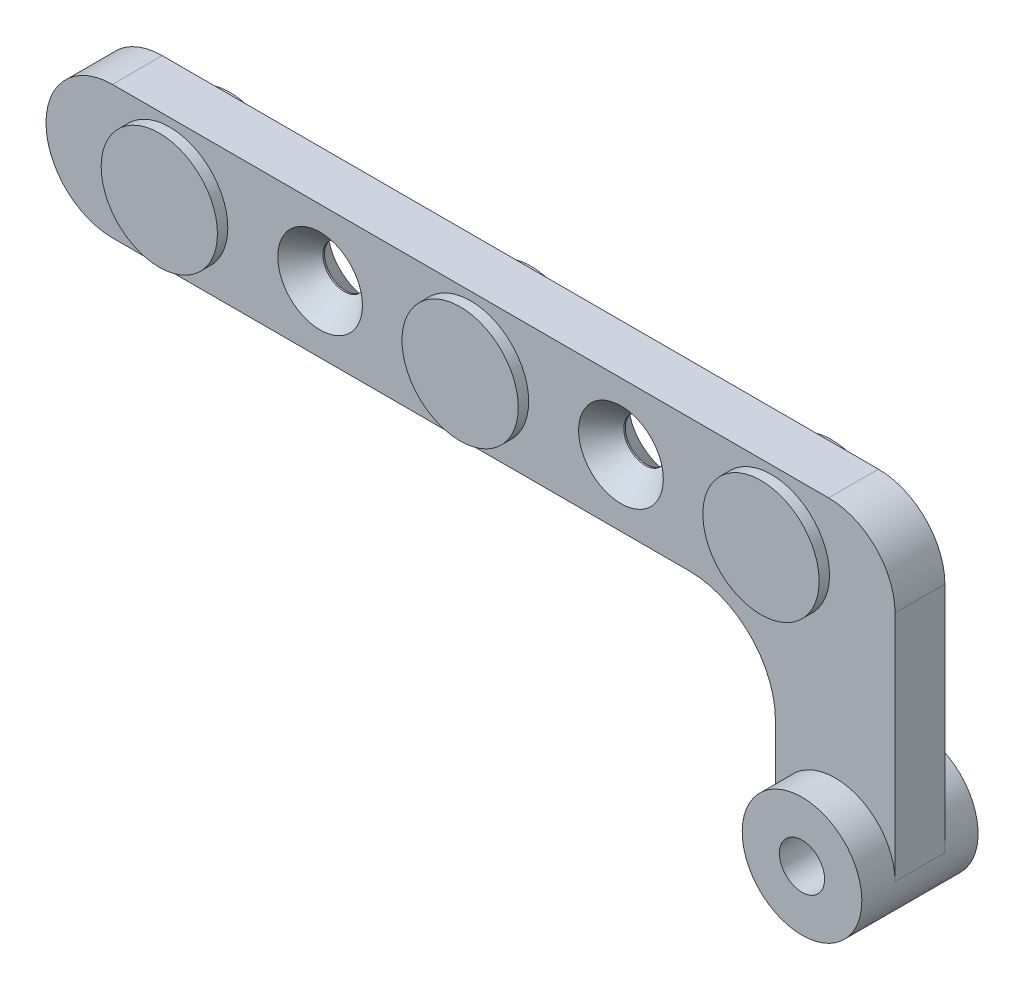
ISO-10303-21;
HEADER;
FILE_DESCRIPTION(('STEP AP214'),'2;1');
FILE_NAME('part.step','',(''),(''),'','','');
FILE_SCHEMA(('AUTOMOTIVE_DESIGN { 1 0 10303 214 1 1 1 1 }'));
ENDSEC;
DATA;
#1=APPLICATION_CONTEXT('core data for automotive mechanical design processes');
#2=APPLICATION_PROTOCOL_DEFINITION('international standard','automotive_design',2000,#1);
#3=PRODUCT_CONTEXT('',#1,'mechanical');
#4=PRODUCT('Part','Part','',(#3));
#5=PRODUCT_RELATED_PRODUCT_CATEGORY('part','',(#4));
#6=PRODUCT_DEFINITION_FORMATION('','',#4);
#7=PRODUCT_DEFINITION_CONTEXT('part definition',#1,'design');
#8=PRODUCT_DEFINITION('design','',#6,#7);
#9=PRODUCT_DEFINITION_SHAPE('','',#8);
#10=(LENGTH_UNIT() NAMED_UNIT(*) SI_UNIT(.MILLI.,.METRE.));
#11=(NAMED_UNIT(*) PLANE_ANGLE_UNIT() SI_UNIT($,.RADIAN.));
#12=(NAMED_UNIT(*) SI_UNIT($,.STERADIAN.) SOLID_ANGLE_UNIT());
#13=UNCERTAINTY_MEASURE_WITH_UNIT(LENGTH_MEASURE(1.E-05),#10,'distance_accuracy_value','');
#14=(GEOMETRIC_REPRESENTATION_CONTEXT(3) GLOBAL_UNCERTAINTY_ASSIGNED_CONTEXT((#13)) GLOBAL_UNIT_ASSIGNED_CONTEXT((#10,
#11,#12)) REPRESENTATION_CONTEXT('',''));
#15=CARTESIAN_POINT('',(0.,0.,0.));
#16=DIRECTION('',(0.,0.,1.));
#17=DIRECTION('',(1.,0.,0.));
#18=AXIS2_PLACEMENT_3D('',#15,#16,#17);
#19=CARTESIAN_POINT('',(27.375,0.,3.81));
#20=DIRECTION('',(0.,0.,-1.));
#21=DIRECTION('',(-1.,0.,0.));
#22=AXIS2_PLACEMENT_3D('',#19,#20,#21);
#23=CYLINDRICAL_SURFACE('',#22,5.07999999999999);
#24=CARTESIAN_POINT('',(27.375,0.,3.81));
#25=DIRECTION('',(0.,0.,1.));
#26=DIRECTION('',(1.,0.,0.));
#27=AXIS2_PLACEMENT_3D('',#24,#25,#26);
#28=CIRCLE('',#27,5.07999999999999);
#29=CARTESIAN_POINT('',(32.455,0.,3.81));
#30=VERTEX_POINT('',#29);
#31=CARTESIAN_POINT('',(27.375,5.08,3.81));
#32=VERTEX_POINT('',#31);
#33=EDGE_CURVE('E226',#30,#32,#28,.T.);
#34=ORIENTED_EDGE('',*,*,#33,.F.);
#35=DIRECTION('',(0.,0.,-1.));
#36=VECTOR('',#35,1.);
#37=CARTESIAN_POINT('',(32.455,0.,27.9600443063776));
#38=LINE('',#37,#36);
#39=CARTESIAN_POINT('',(32.455,0.,0.));
#40=VERTEX_POINT('',#39);
#41=EDGE_CURVE('E140',#30,#40,#38,.T.);
#42=ORIENTED_EDGE('',*,*,#41,.T.);
#43=CARTESIAN_POINT('',(27.375,0.,0.));
#44=DIRECTION('',(0.,0.,1.));
#45=DIRECTION('',(1.,0.,0.));
#46=AXIS2_PLACEMENT_3D('',#43,#44,#45);
#47=CIRCLE('',#46,5.07999999999999);
#48=CARTESIAN_POINT('',(27.375,5.08,0.));
#49=VERTEX_POINT('',#48);
#50=EDGE_CURVE('E240',#40,#49,#47,.T.);
#51=ORIENTED_EDGE('',*,*,#50,.T.);
#52=DIRECTION('',(0.,0.,-1.));
#53=VECTOR('',#52,1.);
#54=CARTESIAN_POINT('',(27.375,5.08,3.81));
#55=LINE('',#54,#53);
#56=EDGE_CURVE('E225',#32,#49,#55,.T.);
#57=ORIENTED_EDGE('',*,*,#56,.F.);
#58=EDGE_LOOP('',(#34,#42,#51,#57));
#59=FACE_BOUND('',#58,.T.);
#60=ADVANCED_FACE('F65',(#59),#23,.T.);
#61=CARTESIAN_POINT('',(27.375,5.08,3.81));
#62=DIRECTION('',(0.,-1.,0.));
#63=DIRECTION('',(1.,0.,0.));
#64=AXIS2_PLACEMENT_3D('',#61,#62,#63);
#65=PLANE('',#64);
#66=DIRECTION('',(-1.,0.,0.));
#67=VECTOR('',#66,1.);
#68=CARTESIAN_POINT('',(27.375,5.08,0.));
#69=LINE('',#68,#67);
#70=CARTESIAN_POINT('',(-27.375,5.07999999999999,0.));
#71=VERTEX_POINT('',#70);
#72=EDGE_CURVE('E243',#49,#71,#69,.T.);
#73=ORIENTED_EDGE('',*,*,#72,.T.);
#74=DIRECTION('',(0.,0.,-1.));
#75=VECTOR('',#74,1.);
#76=CARTESIAN_POINT('',(-27.375,5.07999999999999,3.81));
#77=LINE('',#76,#75);
#78=CARTESIAN_POINT('',(-27.375,5.07999999999999,3.81));
#79=VERTEX_POINT('',#78);
#80=EDGE_CURVE('E253',#79,#71,#77,.T.);
#81=ORIENTED_EDGE('',*,*,#80,.F.);
#82=DIRECTION('',(-1.,0.,0.));
#83=VECTOR('',#82,1.);
#84=CARTESIAN_POINT('',(27.375,5.08,3.81));
#85=LINE('',#84,#83);
#86=EDGE_CURVE('E229',#32,#79,#85,.T.);
#87=ORIENTED_EDGE('',*,*,#86,.F.);
#88=ORIENTED_EDGE('',*,*,#56,.T.);
#89=EDGE_LOOP('',(#73,#81,#87,#88));
#90=FACE_BOUND('',#89,.T.);
#91=ADVANCED_FACE('F440',(#90),#65,.F.);
#92=CARTESIAN_POINT('',(-27.375,0.,3.81));
#93=DIRECTION('',(0.,0.,-1.));
#94=DIRECTION('',(-1.,0.,0.));
#95=AXIS2_PLACEMENT_3D('',#92,#93,#94);
#96=CYLINDRICAL_SURFACE('',#95,5.07999999999999);
#97=CARTESIAN_POINT('',(-27.375,0.,0.));
#98=DIRECTION('',(0.,0.,1.));
#99=DIRECTION('',(1.,0.,0.));
#100=AXIS2_PLACEMENT_3D('',#97,#98,#99);
#101=CIRCLE('',#100,5.07999999999999);
#102=CARTESIAN_POINT('',(-27.375,-5.08,0.));
#103=VERTEX_POINT('',#102);
#104=EDGE_CURVE('E246',#71,#103,#101,.T.);
#105=ORIENTED_EDGE('',*,*,#104,.T.);
#106=DIRECTION('',(0.,0.,-1.));
#107=VECTOR('',#106,1.);
#108=CARTESIAN_POINT('',(-27.375,-5.08,3.81));
#109=LINE('',#108,#107);
#110=CARTESIAN_POINT('',(-27.375,-5.08,3.81));
#111=VERTEX_POINT('',#110);
#112=EDGE_CURVE('E239',#111,#103,#109,.T.);
#113=ORIENTED_EDGE('',*,*,#112,.F.);
#114=CARTESIAN_POINT('',(-27.375,0.,3.81));
#115=DIRECTION('',(0.,0.,1.));
#116=DIRECTION('',(1.,0.,0.));
#117=AXIS2_PLACEMENT_3D('',#114,#115,#116);
#118=CIRCLE('',#117,5.07999999999999);
#119=EDGE_CURVE('E233',#79,#111,#118,.T.);
#120=ORIENTED_EDGE('',*,*,#119,.F.);
#121=ORIENTED_EDGE('',*,*,#80,.T.);
#122=EDGE_LOOP('',(#105,#113,#120,#121));
#123=FACE_BOUND('',#122,.T.);
#124=ADVANCED_FACE('F444',(#123),#96,.T.);
#125=CARTESIAN_POINT('',(27.375,-5.07999999999998,3.81));
#126=DIRECTION('',(0.,1.,0.));
#127=DIRECTION('',(-1.,0.,0.));
#128=AXIS2_PLACEMENT_3D('',#125,#126,#127);
#129=PLANE('',#128);
#130=DIRECTION('',(1.,0.,0.));
#131=VECTOR('',#130,1.);
#132=CARTESIAN_POINT('',(27.375,-5.07999999999998,0.));
#133=LINE('',#132,#131);
#134=CARTESIAN_POINT('',(16.707,-5.07999999999998,0.));
#135=VERTEX_POINT('',#134);
#136=EDGE_CURVE('E230',#103,#135,#133,.T.);
#137=ORIENTED_EDGE('',*,*,#136,.T.);
#138=DIRECTION('',(0.,0.,-1.));
#139=VECTOR('',#138,1.);
#140=CARTESIAN_POINT('',(16.707,-5.07999999999998,3.81));
#141=LINE('',#140,#139);
#142=CARTESIAN_POINT('',(16.707,-5.07999999999998,3.81));
#143=VERTEX_POINT('',#142);
#144=EDGE_CURVE('E81',#135,#143,#141,.F.);
#145=ORIENTED_EDGE('',*,*,#144,.T.);
#146=DIRECTION('',(1.,0.,0.));
#147=VECTOR('',#146,1.);
#148=CARTESIAN_POINT('',(27.375,-5.07999999999998,3.81));
#149=LINE('',#148,#147);
#150=EDGE_CURVE('E236',#111,#143,#149,.T.);
#151=ORIENTED_EDGE('',*,*,#150,.F.);
#152=ORIENTED_EDGE('',*,*,#112,.T.);
#153=EDGE_LOOP('',(#137,#145,#151,#152));
#154=FACE_BOUND('',#153,.T.);
#155=ADVANCED_FACE('F409',(#154),#129,.F.);
#156=CARTESIAN_POINT('',(27.375,0.,3.81));
#157=DIRECTION('',(0.,0.,1.));
#158=DIRECTION('',(1.,0.,0.));
#159=AXIS2_PLACEMENT_3D('',#156,#157,#158);
#160=PLANE('',#159);
#161=CARTESIAN_POINT('',(-11.5,0.,3.81));
#162=DIRECTION('',(0.,0.,1.));
#163=DIRECTION('',(1.,0.,0.));
#164=AXIS2_PLACEMENT_3D('',#161,#162,#163);
#165=CIRCLE('',#164,3.2385);
#166=CARTESIAN_POINT('',(-8.2615,0.,3.81));
#167=VERTEX_POINT('',#166);
#168=EDGE_CURVE('E350',#167,#167,#165,.T.);
#169=ORIENTED_EDGE('',*,*,#168,.F.);
#170=EDGE_LOOP('',(#169));
#171=FACE_BOUND('',#170,.T.);
#172=CARTESIAN_POINT('',(11.5,0.,3.81));
#173=DIRECTION('',(0.,0.,1.));
#174=DIRECTION('',(1.,0.,0.));
#175=AXIS2_PLACEMENT_3D('',#172,#173,#174);
#176=CIRCLE('',#175,3.2385);
#177=CARTESIAN_POINT('',(14.7385,0.,3.81));
#178=VERTEX_POINT('',#177);
#179=EDGE_CURVE('E283',#178,#178,#176,.T.);
#180=ORIENTED_EDGE('',*,*,#179,.F.);
#181=EDGE_LOOP('',(#180));
#182=FACE_BOUND('',#181,.T.);
#183=CARTESIAN_POINT('',(27.883,-17.78,3.81));
#184=DIRECTION('',(0.,0.,1.));
#185=DIRECTION('',(1.,0.,0.));
#186=AXIS2_PLACEMENT_3D('',#183,#184,#185);
#187=CIRCLE('',#186,4.572);
#188=CARTESIAN_POINT('',(32.455,-17.78,3.81));
#189=VERTEX_POINT('',#188);
#190=CARTESIAN_POINT('',(23.311,-17.78,3.81));
#191=VERTEX_POINT('',#190);
#192=EDGE_CURVE('E149',#189,#191,#187,.T.);
#193=ORIENTED_EDGE('',*,*,#192,.F.);
#194=DIRECTION('',(0.,-1.,0.));
#195=VECTOR('',#194,1.);
#196=CARTESIAN_POINT('',(32.455,-5.08000000000001,3.81));
#197=LINE('',#196,#195);
#198=EDGE_CURVE('E179',#30,#189,#197,.T.);
#199=ORIENTED_EDGE('',*,*,#198,.F.);
#200=ORIENTED_EDGE('',*,*,#33,.T.);
#201=ORIENTED_EDGE('',*,*,#86,.T.);
#202=ORIENTED_EDGE('',*,*,#119,.T.);
#203=ORIENTED_EDGE('',*,*,#150,.T.);
#204=CARTESIAN_POINT('',(16.707,-11.684,3.81));
#205=DIRECTION('',(0.,0.,1.));
#206=DIRECTION('',(1.,0.,0.));
#207=AXIS2_PLACEMENT_3D('',#204,#205,#206);
#208=CIRCLE('',#207,6.604);
#209=CARTESIAN_POINT('',(23.311,-11.684,3.81));
#210=VERTEX_POINT('',#209);
#211=EDGE_CURVE('E14',#143,#210,#208,.F.);
#212=ORIENTED_EDGE('',*,*,#211,.T.);
#213=DIRECTION('',(0.,1.,0.));
#214=VECTOR('',#213,1.);
#215=CARTESIAN_POINT('',(23.311,-5.08000000000001,3.81));
#216=LINE('',#215,#214);
#217=EDGE_CURVE('E152',#191,#210,#216,.T.);
#218=ORIENTED_EDGE('',*,*,#217,.F.);
#219=EDGE_LOOP('',(#193,#199,#200,#201,#202,#203,#212,#218));
#220=FACE_BOUND('',#219,.T.);
#221=CARTESIAN_POINT('',(0.,0.,3.81));
#222=DIRECTION('',(0.,0.,1.));
#223=DIRECTION('',(1.,0.,0.));
#224=AXIS2_PLACEMENT_3D('',#221,#222,#223);
#225=CIRCLE('',#224,4.445);
#226=CARTESIAN_POINT('',(4.445,0.,3.81));
#227=VERTEX_POINT('',#226);
#228=EDGE_CURVE('E195',#227,#227,#225,.T.);
#229=ORIENTED_EDGE('',*,*,#228,.F.);
#230=EDGE_LOOP('',(#229));
#231=FACE_BOUND('',#230,.T.);
#232=CARTESIAN_POINT('',(-23.,0.,3.81));
#233=DIRECTION('',(0.,0.,1.));
#234=DIRECTION('',(1.,0.,0.));
#235=AXIS2_PLACEMENT_3D('',#232,#233,#234);
#236=CIRCLE('',#235,4.445);
#237=CARTESIAN_POINT('',(-18.555,0.,3.81));
#238=VERTEX_POINT('',#237);
#239=EDGE_CURVE('E199',#238,#238,#236,.T.);
#240=ORIENTED_EDGE('',*,*,#239,.F.);
#241=EDGE_LOOP('',(#240));
#242=FACE_BOUND('',#241,.T.);
#243=CARTESIAN_POINT('',(23.,0.,3.81));
#244=DIRECTION('',(0.,0.,1.));
#245=DIRECTION('',(1.,0.,0.));
#246=AXIS2_PLACEMENT_3D('',#243,#244,#245);
#247=CIRCLE('',#246,4.445);
#248=CARTESIAN_POINT('',(27.445,0.,3.81));
#249=VERTEX_POINT('',#248);
#250=EDGE_CURVE('E212',#249,#249,#247,.T.);
#251=ORIENTED_EDGE('',*,*,#250,.F.);
#252=EDGE_LOOP('',(#251));
#253=FACE_BOUND('',#252,.T.);
#254=ADVANCED_FACE('F406',(#171,#182,#220,#231,#242,#253),#160,.T.);
#255=CARTESIAN_POINT('',(27.375,0.,0.));
#256=DIRECTION('',(0.,0.,1.));
#257=DIRECTION('',(1.,0.,0.));
#258=AXIS2_PLACEMENT_3D('',#255,#256,#257);
#259=PLANE('',#258);
#260=CARTESIAN_POINT('',(-11.5,0.,0.));
#261=DIRECTION('',(0.,0.,-1.));
#262=DIRECTION('',(-1.,0.,0.));
#263=AXIS2_PLACEMENT_3D('',#260,#261,#262);
#264=CIRCLE('',#263,3.2385);
#265=CARTESIAN_POINT('',(-14.7385,0.,0.));
#266=VERTEX_POINT('',#265);
#267=EDGE_CURVE('E359',#266,#266,#264,.T.);
#268=ORIENTED_EDGE('',*,*,#267,.F.);
#269=EDGE_LOOP('',(#268));
#270=FACE_BOUND('',#269,.T.);
#271=CARTESIAN_POINT('',(11.5,0.,0.));
#272=DIRECTION('',(0.,0.,-1.));
#273=DIRECTION('',(-1.,0.,0.));
#274=AXIS2_PLACEMENT_3D('',#271,#272,#273);
#275=CIRCLE('',#274,3.2385);
#276=CARTESIAN_POINT('',(8.2615,0.,0.));
#277=VERTEX_POINT('',#276);
#278=EDGE_CURVE('E305',#277,#277,#275,.T.);
#279=ORIENTED_EDGE('',*,*,#278,.F.);
#280=EDGE_LOOP('',(#279));
#281=FACE_BOUND('',#280,.T.);
#282=DIRECTION('',(0.,-1.,0.));
#283=VECTOR('',#282,1.);
#284=CARTESIAN_POINT('',(32.455,-5.08000000000001,0.));
#285=LINE('',#284,#283);
#286=CARTESIAN_POINT('',(32.455,-17.78,0.));
#287=VERTEX_POINT('',#286);
#288=EDGE_CURVE('E141',#40,#287,#285,.T.);
#289=ORIENTED_EDGE('',*,*,#288,.T.);
#290=CARTESIAN_POINT('',(27.883,-17.78,0.));
#291=DIRECTION('',(0.,0.,1.));
#292=DIRECTION('',(1.,0.,0.));
#293=AXIS2_PLACEMENT_3D('',#290,#291,#292);
#294=CIRCLE('',#293,4.572);
#295=CARTESIAN_POINT('',(23.311,-17.78,0.));
#296=VERTEX_POINT('',#295);
#297=EDGE_CURVE('E148',#287,#296,#294,.T.);
#298=ORIENTED_EDGE('',*,*,#297,.T.);
#299=DIRECTION('',(0.,1.,0.));
#300=VECTOR('',#299,1.);
#301=CARTESIAN_POINT('',(23.311,-5.08000000000001,0.));
#302=LINE('',#301,#300);
#303=CARTESIAN_POINT('',(23.311,-11.684,0.));
#304=VERTEX_POINT('',#303);
#305=EDGE_CURVE('E131',#296,#304,#302,.T.);
#306=ORIENTED_EDGE('',*,*,#305,.T.);
#307=CARTESIAN_POINT('',(16.707,-11.684,0.));
#308=DIRECTION('',(0.,0.,1.));
#309=DIRECTION('',(1.,0.,0.));
#310=AXIS2_PLACEMENT_3D('',#307,#308,#309);
#311=CIRCLE('',#310,6.604);
#312=EDGE_CURVE('E74',#304,#135,#311,.T.);
#313=ORIENTED_EDGE('',*,*,#312,.T.);
#314=ORIENTED_EDGE('',*,*,#136,.F.);
#315=ORIENTED_EDGE('',*,*,#104,.F.);
#316=ORIENTED_EDGE('',*,*,#72,.F.);
#317=ORIENTED_EDGE('',*,*,#50,.F.);
#318=EDGE_LOOP('',(#289,#298,#306,#313,#314,#315,#316,#317));
#319=FACE_BOUND('',#318,.T.);
#320=CARTESIAN_POINT('',(0.,0.,0.));
#321=DIRECTION('',(0.,0.,1.));
#322=DIRECTION('',(1.,0.,0.));
#323=AXIS2_PLACEMENT_3D('',#320,#321,#322);
#324=CIRCLE('',#323,4.445);
#325=CARTESIAN_POINT('',(4.445,0.,0.));
#326=VERTEX_POINT('',#325);
#327=EDGE_CURVE('E194',#326,#326,#324,.T.);
#328=ORIENTED_EDGE('',*,*,#327,.T.);
#329=EDGE_LOOP('',(#328));
#330=FACE_BOUND('',#329,.T.);
#331=CARTESIAN_POINT('',(-23.,0.,0.));
#332=DIRECTION('',(0.,0.,1.));
#333=DIRECTION('',(1.,0.,0.));
#334=AXIS2_PLACEMENT_3D('',#331,#332,#333);
#335=CIRCLE('',#334,4.445);
#336=CARTESIAN_POINT('',(-18.555,0.,0.));
#337=VERTEX_POINT('',#336);
#338=EDGE_CURVE('E208',#337,#337,#335,.T.);
#339=ORIENTED_EDGE('',*,*,#338,.T.);
#340=EDGE_LOOP('',(#339));
#341=FACE_BOUND('',#340,.T.);
#342=CARTESIAN_POINT('',(23.,0.,0.));
#343=DIRECTION('',(0.,0.,1.));
#344=DIRECTION('',(1.,0.,0.));
#345=AXIS2_PLACEMENT_3D('',#342,#343,#344);
#346=CIRCLE('',#345,4.445);
#347=CARTESIAN_POINT('',(27.445,0.,0.));
#348=VERTEX_POINT('',#347);
#349=EDGE_CURVE('E221',#348,#348,#346,.T.);
#350=ORIENTED_EDGE('',*,*,#349,.T.);
#351=EDGE_LOOP('',(#350));
#352=FACE_BOUND('',#351,.T.);
#353=ADVANCED_FACE('F156',(#270,#281,#319,#330,#341,#352),#259,.F.);
#354=CARTESIAN_POINT('',(27.375,0.,-0.79375));
#355=DIRECTION('',(0.,0.,1.));
#356=DIRECTION('',(1.,0.,0.));
#357=AXIS2_PLACEMENT_3D('',#354,#355,#356);
#358=PLANE('',#357);
#359=CARTESIAN_POINT('',(23.,0.,-0.793749999999999));
#360=DIRECTION('',(0.,0.,1.));
#361=DIRECTION('',(1.,0.,0.));
#362=AXIS2_PLACEMENT_3D('',#359,#360,#361);
#363=CIRCLE('',#362,4.445);
#364=CARTESIAN_POINT('',(27.445,0.,-0.793749999999999));
#365=VERTEX_POINT('',#364);
#366=EDGE_CURVE('E217',#365,#365,#363,.F.);
#367=ORIENTED_EDGE('',*,*,#366,.T.);
#368=EDGE_LOOP('',(#367));
#369=FACE_BOUND('',#368,.T.);
#370=ADVANCED_FACE('F454',(#369),#358,.F.);
#371=CARTESIAN_POINT('',(23.,0.,-14.1598585694968));
#372=DIRECTION('',(0.,0.,1.));
#373=DIRECTION('',(1.,0.,0.));
#374=AXIS2_PLACEMENT_3D('',#371,#372,#373);
#375=CYLINDRICAL_SURFACE('',#374,4.445);
#376=ORIENTED_EDGE('',*,*,#366,.F.);
#377=EDGE_LOOP('',(#376));
#378=FACE_BOUND('',#377,.T.);
#379=ORIENTED_EDGE('',*,*,#349,.F.);
#380=EDGE_LOOP('',(#379));
#381=FACE_BOUND('',#380,.T.);
#382=ADVANCED_FACE('F425',(#378,#381),#375,.T.);
#383=ORIENTED_EDGE('',*,*,#250,.T.);
#384=EDGE_LOOP('',(#383));
#385=FACE_BOUND('',#384,.T.);
#386=CARTESIAN_POINT('',(23.,0.,4.60375));
#387=DIRECTION('',(0.,0.,1.));
#388=DIRECTION('',(1.,0.,0.));
#389=AXIS2_PLACEMENT_3D('',#386,#387,#388);
#390=CIRCLE('',#389,4.445);
#391=CARTESIAN_POINT('',(27.445,0.,4.60375));
#392=VERTEX_POINT('',#391);
#393=EDGE_CURVE('E213',#392,#392,#390,.T.);
#394=ORIENTED_EDGE('',*,*,#393,.F.);
#395=EDGE_LOOP('',(#394));
#396=FACE_BOUND('',#395,.T.);
#397=ADVANCED_FACE('F421',(#385,#396),#375,.T.);
#398=CARTESIAN_POINT('',(23.,0.,4.60375));
#399=DIRECTION('',(0.,0.,1.));
#400=DIRECTION('',(1.,0.,0.));
#401=AXIS2_PLACEMENT_3D('',#398,#399,#400);
#402=PLANE('',#401);
#403=ORIENTED_EDGE('',*,*,#393,.T.);
#404=EDGE_LOOP('',(#403));
#405=FACE_BOUND('',#404,.T.);
#406=ADVANCED_FACE('F424',(#405),#402,.T.);
#407=CARTESIAN_POINT('',(27.375,0.,-0.79375));
#408=DIRECTION('',(0.,0.,1.));
#409=DIRECTION('',(1.,0.,0.));
#410=AXIS2_PLACEMENT_3D('',#407,#408,#409);
#411=PLANE('',#410);
#412=CARTESIAN_POINT('',(-23.,0.,-0.793749999999999));
#413=DIRECTION('',(0.,0.,1.));
#414=DIRECTION('',(1.,0.,0.));
#415=AXIS2_PLACEMENT_3D('',#412,#413,#414);
#416=CIRCLE('',#415,4.445);
#417=CARTESIAN_POINT('',(-18.555,0.,-0.793749999999999));
#418=VERTEX_POINT('',#417);
#419=EDGE_CURVE('E200',#418,#418,#416,.F.);
#420=ORIENTED_EDGE('',*,*,#419,.T.);
#421=EDGE_LOOP('',(#420));
#422=FACE_BOUND('',#421,.T.);
#423=ADVANCED_FACE('F430',(#422),#411,.F.);
#424=CARTESIAN_POINT('',(-23.,0.,-14.1598585694968));
#425=DIRECTION('',(0.,0.,1.));
#426=DIRECTION('',(1.,0.,0.));
#427=AXIS2_PLACEMENT_3D('',#424,#425,#426);
#428=CYLINDRICAL_SURFACE('',#427,4.445);
#429=ORIENTED_EDGE('',*,*,#419,.F.);
#430=EDGE_LOOP('',(#429));
#431=FACE_BOUND('',#430,.T.);
#432=ORIENTED_EDGE('',*,*,#338,.F.);
#433=EDGE_LOOP('',(#432));
#434=FACE_BOUND('',#433,.T.);
#435=ADVANCED_FACE('F434',(#431,#434),#428,.T.);
#436=ORIENTED_EDGE('',*,*,#239,.T.);
#437=EDGE_LOOP('',(#436));
#438=FACE_BOUND('',#437,.T.);
#439=CARTESIAN_POINT('',(-23.,0.,4.60375));
#440=DIRECTION('',(0.,0.,1.));
#441=DIRECTION('',(-1.,0.,0.));
#442=AXIS2_PLACEMENT_3D('',#439,#440,#441);
#443=CIRCLE('',#442,4.445);
#444=CARTESIAN_POINT('',(-27.445,0.,4.60375));
#445=VERTEX_POINT('',#444);
#446=EDGE_CURVE('E204',#445,#445,#443,.T.);
#447=ORIENTED_EDGE('',*,*,#446,.F.);
#448=EDGE_LOOP('',(#447));
#449=FACE_BOUND('',#448,.T.);
#450=ADVANCED_FACE('F490',(#438,#449),#428,.T.);
#451=CARTESIAN_POINT('',(-23.,0.,4.60375));
#452=DIRECTION('',(0.,0.,-1.));
#453=DIRECTION('',(-1.,0.,0.));
#454=AXIS2_PLACEMENT_3D('',#451,#452,#453);
#455=PLANE('',#454);
#456=ORIENTED_EDGE('',*,*,#446,.T.);
#457=EDGE_LOOP('',(#456));
#458=FACE_BOUND('',#457,.T.);
#459=ADVANCED_FACE('F500',(#458),#455,.F.);
#460=CARTESIAN_POINT('',(27.375,0.,-0.79375));
#461=DIRECTION('',(0.,0.,1.));
#462=DIRECTION('',(1.,0.,0.));
#463=AXIS2_PLACEMENT_3D('',#460,#461,#462);
#464=PLANE('',#463);
#465=CARTESIAN_POINT('',(0.,0.,-0.793749999999999));
#466=DIRECTION('',(0.,0.,1.));
#467=DIRECTION('',(1.,0.,0.));
#468=AXIS2_PLACEMENT_3D('',#465,#466,#467);
#469=CIRCLE('',#468,4.445);
#470=CARTESIAN_POINT('',(4.445,0.,-0.793749999999999));
#471=VERTEX_POINT('',#470);
#472=EDGE_CURVE('E178',#471,#471,#469,.F.);
#473=ORIENTED_EDGE('',*,*,#472,.T.);
#474=EDGE_LOOP('',(#473));
#475=FACE_BOUND('',#474,.T.);
#476=ADVANCED_FACE('F509',(#475),#464,.F.);
#477=CARTESIAN_POINT('',(0.,0.,-14.1598585694968));
#478=DIRECTION('',(0.,0.,1.));
#479=DIRECTION('',(1.,0.,0.));
#480=AXIS2_PLACEMENT_3D('',#477,#478,#479);
#481=CYLINDRICAL_SURFACE('',#480,4.445);
#482=ORIENTED_EDGE('',*,*,#472,.F.);
#483=EDGE_LOOP('',(#482));
#484=FACE_BOUND('',#483,.T.);
#485=ORIENTED_EDGE('',*,*,#327,.F.);
#486=EDGE_LOOP('',(#485));
#487=FACE_BOUND('',#486,.T.);
#488=ADVANCED_FACE('F518',(#484,#487),#481,.T.);
#489=ORIENTED_EDGE('',*,*,#228,.T.);
#490=EDGE_LOOP('',(#489));
#491=FACE_BOUND('',#490,.T.);
#492=CARTESIAN_POINT('',(0.,0.,4.60375));
#493=DIRECTION('',(0.,0.,1.));
#494=DIRECTION('',(1.,0.,0.));
#495=AXIS2_PLACEMENT_3D('',#492,#493,#494);
#496=CIRCLE('',#495,4.445);
#497=CARTESIAN_POINT('',(4.445,0.,4.60375));
#498=VERTEX_POINT('',#497);
#499=EDGE_CURVE('E190',#498,#498,#496,.T.);
#500=ORIENTED_EDGE('',*,*,#499,.F.);
#501=EDGE_LOOP('',(#500));
#502=FACE_BOUND('',#501,.T.);
#503=ADVANCED_FACE('F528',(#491,#502),#481,.T.);
#504=CARTESIAN_POINT('',(0.,0.,4.60375));
#505=DIRECTION('',(0.,0.,1.));
#506=DIRECTION('',(1.,0.,0.));
#507=AXIS2_PLACEMENT_3D('',#504,#505,#506);
#508=PLANE('',#507);
#509=ORIENTED_EDGE('',*,*,#499,.T.);
#510=EDGE_LOOP('',(#509));
#511=FACE_BOUND('',#510,.T.);
#512=ADVANCED_FACE('F538',(#511),#508,.T.);
#513=CARTESIAN_POINT('',(32.455,-5.08000000000001,27.9600443063776));
#514=DIRECTION('',(1.,0.,0.));
#515=DIRECTION('',(0.,0.,-1.));
#516=AXIS2_PLACEMENT_3D('',#513,#514,#515);
#517=PLANE('',#516);
#518=ORIENTED_EDGE('',*,*,#41,.F.);
#519=ORIENTED_EDGE('',*,*,#198,.T.);
#520=DIRECTION('',(0.,0.,-1.));
#521=VECTOR('',#520,1.);
#522=CARTESIAN_POINT('',(32.455,-17.78,27.9600443063776));
#523=LINE('',#522,#521);
#524=EDGE_CURVE('E153',#189,#287,#523,.T.);
#525=ORIENTED_EDGE('',*,*,#524,.T.);
#526=ORIENTED_EDGE('',*,*,#288,.F.);
#527=EDGE_LOOP('',(#518,#519,#525,#526));
#528=FACE_BOUND('',#527,.T.);
#529=ADVANCED_FACE('F546',(#528),#517,.T.);
#530=CARTESIAN_POINT('',(27.883,-17.78,27.9600443063776));
#531=DIRECTION('',(0.,0.,-1.));
#532=DIRECTION('',(-1.,0.,0.));
#533=AXIS2_PLACEMENT_3D('',#530,#531,#532);
#534=CYLINDRICAL_SURFACE('',#533,4.572);
#535=ORIENTED_EDGE('',*,*,#524,.F.);
#536=ORIENTED_EDGE('',*,*,#192,.T.);
#537=DIRECTION('',(0.,0.,-1.));
#538=VECTOR('',#537,1.);
#539=CARTESIAN_POINT('',(23.311,-17.78,27.9600443063776));
#540=LINE('',#539,#538);
#541=EDGE_CURVE('E135',#191,#296,#540,.T.);
#542=ORIENTED_EDGE('',*,*,#541,.T.);
#543=ORIENTED_EDGE('',*,*,#297,.F.);
#544=EDGE_LOOP('',(#535,#536,#542,#543));
#545=FACE_BOUND('',#544,.T.);
#546=CARTESIAN_POINT('',(27.883,-17.78,-2.54));
#547=DIRECTION('',(0.,0.,-1.));
#548=DIRECTION('',(-1.,0.,0.));
#549=AXIS2_PLACEMENT_3D('',#546,#547,#548);
#550=CIRCLE('',#549,4.572);
#551=CARTESIAN_POINT('',(23.311,-17.78,-2.54));
#552=VERTEX_POINT('',#551);
#553=EDGE_CURVE('E170',#552,#552,#550,.T.);
#554=ORIENTED_EDGE('',*,*,#553,.F.);
#555=EDGE_LOOP('',(#554));
#556=FACE_BOUND('',#555,.T.);
#557=CARTESIAN_POINT('',(27.883,-17.78,6.35));
#558=DIRECTION('',(0.,0.,1.));
#559=DIRECTION('',(1.,0.,0.));
#560=AXIS2_PLACEMENT_3D('',#557,#558,#559);
#561=CIRCLE('',#560,4.572);
#562=CARTESIAN_POINT('',(32.455,-17.78,6.35));
#563=VERTEX_POINT('',#562);
#564=EDGE_CURVE('E161',#563,#563,#561,.F.);
#565=ORIENTED_EDGE('',*,*,#564,.T.);
#566=EDGE_LOOP('',(#565));
#567=FACE_BOUND('',#566,.T.);
#568=ADVANCED_FACE('F146',(#545,#556,#567),#534,.T.);
#569=CARTESIAN_POINT('',(23.311,-5.08000000000001,27.9600443063776));
#570=DIRECTION('',(-1.,0.,0.));
#571=DIRECTION('',(0.,0.,1.));
#572=AXIS2_PLACEMENT_3D('',#569,#570,#571);
#573=PLANE('',#572);
#574=ORIENTED_EDGE('',*,*,#217,.T.);
#575=DIRECTION('',(0.,0.,-1.));
#576=VECTOR('',#575,1.);
#577=CARTESIAN_POINT('',(23.311,-11.684,27.9600443063776));
#578=LINE('',#577,#576);
#579=EDGE_CURVE('E137',#210,#304,#578,.T.);
#580=ORIENTED_EDGE('',*,*,#579,.T.);
#581=ORIENTED_EDGE('',*,*,#305,.F.);
#582=ORIENTED_EDGE('',*,*,#541,.F.);
#583=EDGE_LOOP('',(#574,#580,#581,#582));
#584=FACE_BOUND('',#583,.T.);
#585=ADVANCED_FACE('F134',(#584),#573,.T.);
#586=CARTESIAN_POINT('',(27.883,-17.78,-2.54));
#587=DIRECTION('',(0.,0.,-1.));
#588=DIRECTION('',(-1.,0.,0.));
#589=AXIS2_PLACEMENT_3D('',#586,#587,#588);
#590=PLANE('',#589);
#591=CARTESIAN_POINT('',(27.883,-17.78,-2.54));
#592=DIRECTION('',(0.,0.,-1.));
#593=DIRECTION('',(-1.,0.,0.));
#594=AXIS2_PLACEMENT_3D('',#591,#592,#593);
#595=CIRCLE('',#594,1.7272);
#596=CARTESIAN_POINT('',(26.1558,-17.78,-2.54));
#597=VERTEX_POINT('',#596);
#598=EDGE_CURVE('E334',#597,#597,#595,.T.);
#599=ORIENTED_EDGE('',*,*,#598,.F.);
#600=EDGE_LOOP('',(#599));
#601=FACE_BOUND('',#600,.T.);
#602=ORIENTED_EDGE('',*,*,#553,.T.);
#603=EDGE_LOOP('',(#602));
#604=FACE_BOUND('',#603,.T.);
#605=ADVANCED_FACE('F580',(#601,#604),#590,.T.);
#606=CARTESIAN_POINT('',(27.375,0.,6.35));
#607=DIRECTION('',(0.,0.,1.));
#608=DIRECTION('',(1.,0.,0.));
#609=AXIS2_PLACEMENT_3D('',#606,#607,#608);
#610=PLANE('',#609);
#611=CARTESIAN_POINT('',(27.883,-17.78,6.35));
#612=DIRECTION('',(0.,0.,-1.));
#613=DIRECTION('',(-1.,0.,0.));
#614=AXIS2_PLACEMENT_3D('',#611,#612,#613);
#615=CIRCLE('',#614,1.7272);
#616=CARTESIAN_POINT('',(26.1558,-17.78,6.35));
#617=VERTEX_POINT('',#616);
#618=EDGE_CURVE('E295',#617,#617,#615,.T.);
#619=ORIENTED_EDGE('',*,*,#618,.T.);
#620=EDGE_LOOP('',(#619));
#621=FACE_BOUND('',#620,.T.);
#622=ORIENTED_EDGE('',*,*,#564,.F.);
#623=EDGE_LOOP('',(#622));
#624=FACE_BOUND('',#623,.T.);
#625=ADVANCED_FACE('F584',(#621,#624),#610,.T.);
#626=CARTESIAN_POINT('',(27.883,-17.78,-2.54));
#627=DIRECTION('',(0.,0.,-1.));
#628=DIRECTION('',(-1.,0.,0.));
#629=AXIS2_PLACEMENT_3D('',#626,#627,#628);
#630=CYLINDRICAL_SURFACE('',#629,1.7272);
#631=ORIENTED_EDGE('',*,*,#618,.F.);
#632=EDGE_LOOP('',(#631));
#633=FACE_BOUND('',#632,.T.);
#634=ORIENTED_EDGE('',*,*,#598,.T.);
#635=EDGE_LOOP('',(#634));
#636=FACE_BOUND('',#635,.T.);
#637=ADVANCED_FACE('F594',(#633,#636),#630,.F.);
#638=CARTESIAN_POINT('',(16.707,-11.684,27.9600443063776));
#639=DIRECTION('',(0.,0.,-1.));
#640=DIRECTION('',(-1.,0.,0.));
#641=AXIS2_PLACEMENT_3D('',#638,#639,#640);
#642=CYLINDRICAL_SURFACE('',#641,6.604);
#643=ORIENTED_EDGE('',*,*,#211,.F.);
#644=ORIENTED_EDGE('',*,*,#144,.F.);
#645=ORIENTED_EDGE('',*,*,#312,.F.);
#646=ORIENTED_EDGE('',*,*,#579,.F.);
#647=EDGE_LOOP('',(#643,#644,#645,#646));
#648=FACE_BOUND('',#647,.T.);
#649=ADVANCED_FACE('F67',(#648),#642,.F.);
#650=CARTESIAN_POINT('',(11.5,0.,0.));
#651=DIRECTION('',(0.,0.,-1.));
#652=DIRECTION('',(-1.,0.,0.));
#653=AXIS2_PLACEMENT_3D('',#650,#651,#652);
#654=CYLINDRICAL_SURFACE('',#653,1.63195);
#655=CARTESIAN_POINT('',(11.5,0.,1.96187563537908));
#656=DIRECTION('',(0.,0.,1.));
#657=DIRECTION('',(1.,0.,0.));
#658=AXIS2_PLACEMENT_3D('',#655,#656,#657);
#659=CIRCLE('',#658,1.63195);
#660=CARTESIAN_POINT('',(13.13195,0.,1.96187563537908));
#661=VERTEX_POINT('',#660);
#662=EDGE_CURVE('E287',#661,#661,#659,.T.);
#663=ORIENTED_EDGE('',*,*,#662,.T.);
#664=EDGE_LOOP('',(#663));
#665=FACE_BOUND('',#664,.T.);
#666=CARTESIAN_POINT('',(11.5,0.,1.84812436462092));
#667=DIRECTION('',(0.,0.,-1.));
#668=DIRECTION('',(-1.,0.,0.));
#669=AXIS2_PLACEMENT_3D('',#666,#667,#668);
#670=CIRCLE('',#669,1.63195);
#671=CARTESIAN_POINT('',(9.86805,0.,1.84812436462092));
#672=VERTEX_POINT('',#671);
#673=EDGE_CURVE('E308',#672,#672,#670,.T.);
#674=ORIENTED_EDGE('',*,*,#673,.T.);
#675=EDGE_LOOP('',(#674));
#676=FACE_BOUND('',#675,.T.);
#677=ADVANCED_FACE('F630',(#665,#676),#654,.F.);
#678=CARTESIAN_POINT('',(11.5,0.,0.));
#679=DIRECTION('',(0.,0.,-1.));
#680=DIRECTION('',(-1.,0.,0.));
#681=AXIS2_PLACEMENT_3D('',#678,#679,#680);
#682=CONICAL_SURFACE('',#681,3.2385,0.715584993317675);
#683=ORIENTED_EDGE('',*,*,#673,.F.);
#684=EDGE_LOOP('',(#683));
#685=FACE_BOUND('',#684,.T.);
#686=ORIENTED_EDGE('',*,*,#278,.T.);
#687=EDGE_LOOP('',(#686));
#688=FACE_BOUND('',#687,.T.);
#689=ADVANCED_FACE('F643',(#685,#688),#682,.F.);
#690=CARTESIAN_POINT('',(-11.5,0.,0.));
#691=DIRECTION('',(0.,0.,-1.));
#692=DIRECTION('',(-1.,0.,0.));
#693=AXIS2_PLACEMENT_3D('',#690,#691,#692);
#694=CYLINDRICAL_SURFACE('',#693,1.63195);
#695=CARTESIAN_POINT('',(-11.5,0.,1.96187563537908));
#696=DIRECTION('',(0.,0.,1.));
#697=DIRECTION('',(1.,0.,0.));
#698=AXIS2_PLACEMENT_3D('',#695,#696,#697);
#699=CIRCLE('',#698,1.63195);
#700=CARTESIAN_POINT('',(-9.86805,0.,1.96187563537908));
#701=VERTEX_POINT('',#700);
#702=EDGE_CURVE('E288',#701,#701,#699,.T.);
#703=ORIENTED_EDGE('',*,*,#702,.T.);
#704=EDGE_LOOP('',(#703));
#705=FACE_BOUND('',#704,.T.);
#706=CARTESIAN_POINT('',(-11.5,0.,1.84812436462092));
#707=DIRECTION('',(0.,0.,-1.));
#708=DIRECTION('',(-1.,0.,0.));
#709=AXIS2_PLACEMENT_3D('',#706,#707,#708);
#710=CIRCLE('',#709,1.63195);
#711=CARTESIAN_POINT('',(-13.13195,0.,1.84812436462092));
#712=VERTEX_POINT('',#711);
#713=EDGE_CURVE('E309',#712,#712,#710,.T.);
#714=ORIENTED_EDGE('',*,*,#713,.T.);
#715=EDGE_LOOP('',(#714));
#716=FACE_BOUND('',#715,.T.);
#717=ADVANCED_FACE('F648',(#705,#716),#694,.F.);
#718=CARTESIAN_POINT('',(-11.5,0.,0.));
#719=DIRECTION('',(0.,0.,-1.));
#720=DIRECTION('',(-1.,0.,0.));
#721=AXIS2_PLACEMENT_3D('',#718,#719,#720);
#722=CONICAL_SURFACE('',#721,3.2385,0.715584993317675);
#723=ORIENTED_EDGE('',*,*,#713,.F.);
#724=EDGE_LOOP('',(#723));
#725=FACE_BOUND('',#724,.T.);
#726=ORIENTED_EDGE('',*,*,#267,.T.);
#727=EDGE_LOOP('',(#726));
#728=FACE_BOUND('',#727,.T.);
#729=ADVANCED_FACE('F656',(#725,#728),#722,.F.);
#730=CARTESIAN_POINT('',(11.5,0.,3.81));
#731=DIRECTION('',(0.,0.,1.));
#732=DIRECTION('',(1.,0.,0.));
#733=AXIS2_PLACEMENT_3D('',#730,#731,#732);
#734=CONICAL_SURFACE('',#733,3.2385,0.715584993317675);
#735=ORIENTED_EDGE('',*,*,#662,.F.);
#736=EDGE_LOOP('',(#735));
#737=FACE_BOUND('',#736,.T.);
#738=ORIENTED_EDGE('',*,*,#179,.T.);
#739=EDGE_LOOP('',(#738));
#740=FACE_BOUND('',#739,.T.);
#741=ADVANCED_FACE('F661',(#737,#740),#734,.F.);
#742=CARTESIAN_POINT('',(-11.5,0.,3.81));
#743=DIRECTION('',(0.,0.,1.));
#744=DIRECTION('',(1.,0.,0.));
#745=AXIS2_PLACEMENT_3D('',#742,#743,#744);
#746=CONICAL_SURFACE('',#745,3.2385,0.715584993317675);
#747=ORIENTED_EDGE('',*,*,#702,.F.);
#748=EDGE_LOOP('',(#747));
#749=FACE_BOUND('',#748,.T.);
#750=ORIENTED_EDGE('',*,*,#168,.T.);
#751=EDGE_LOOP('',(#750));
#752=FACE_BOUND('',#751,.T.);
#753=ADVANCED_FACE('F404',(#749,#752),#746,.F.);
#754=CLOSED_SHELL('',(#60,#91,#124,#155,#254,#353,#370,#382,#397,#406,#423,#435,#450,#459,#476,
#488,#503,#512,#529,#568,#585,#605,#625,#637,#649,#677,#689,#717,#729,#741,#753));
#755=MANIFOLD_SOLID_BREP('B2',#754);
#756=ADVANCED_BREP_SHAPE_REPRESENTATION('',(#18,#755),#14);
#757=SHAPE_DEFINITION_REPRESENTATION(#9,#756);
ENDSEC;
END-ISO-10303-21;
